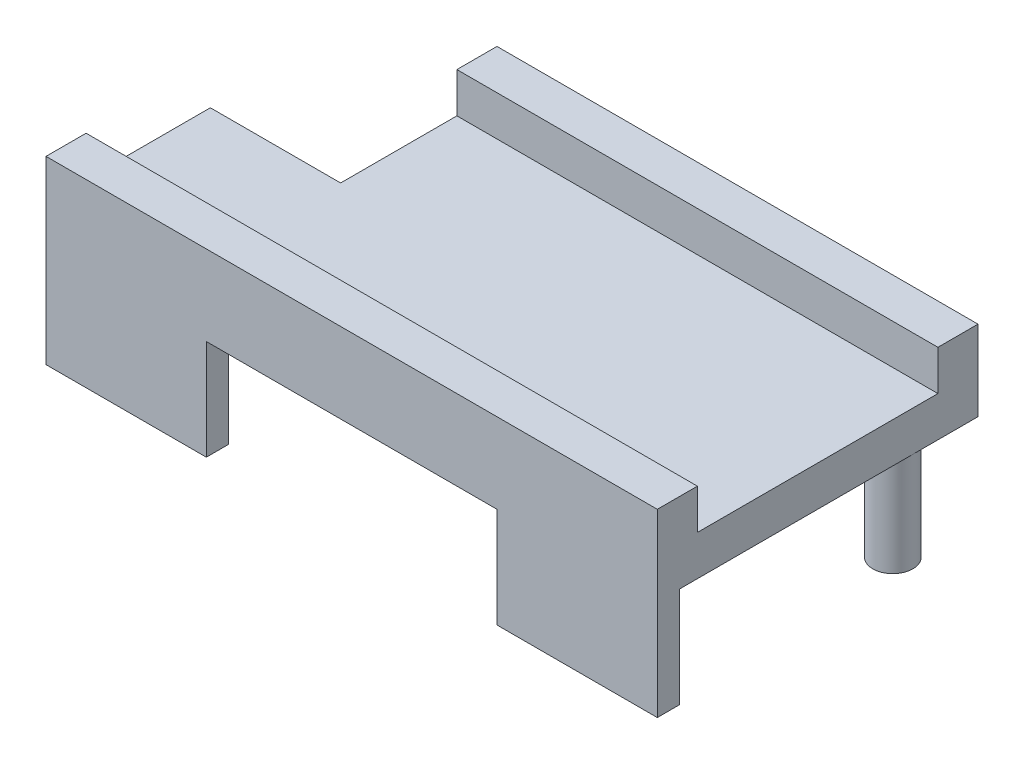
ISO-10303-21;
HEADER;
FILE_DESCRIPTION(('STEP AP214'),'2;1');
FILE_NAME('part.step','',(''),(''),'','','');
FILE_SCHEMA(('AUTOMOTIVE_DESIGN { 1 0 10303 214 1 1 1 1 }'));
ENDSEC;
DATA;
#1=APPLICATION_CONTEXT('core data for automotive mechanical design processes');
#2=APPLICATION_PROTOCOL_DEFINITION('international standard','automotive_design',2000,#1);
#3=PRODUCT_CONTEXT('',#1,'mechanical');
#4=PRODUCT('Part','Part','',(#3));
#5=PRODUCT_RELATED_PRODUCT_CATEGORY('part','',(#4));
#6=PRODUCT_DEFINITION_FORMATION('','',#4);
#7=PRODUCT_DEFINITION_CONTEXT('part definition',#1,'design');
#8=PRODUCT_DEFINITION('design','',#6,#7);
#9=PRODUCT_DEFINITION_SHAPE('','',#8);
#10=(LENGTH_UNIT() NAMED_UNIT(*) SI_UNIT(.MILLI.,.METRE.));
#11=(NAMED_UNIT(*) PLANE_ANGLE_UNIT() SI_UNIT($,.RADIAN.));
#12=(NAMED_UNIT(*) SI_UNIT($,.STERADIAN.) SOLID_ANGLE_UNIT());
#13=UNCERTAINTY_MEASURE_WITH_UNIT(LENGTH_MEASURE(1.E-05),#10,'distance_accuracy_value','');
#14=(GEOMETRIC_REPRESENTATION_CONTEXT(3) GLOBAL_UNCERTAINTY_ASSIGNED_CONTEXT((#13)) GLOBAL_UNIT_ASSIGNED_CONTEXT((#10,
#11,#12)) REPRESENTATION_CONTEXT('',''));
#15=CARTESIAN_POINT('',(0.,0.,0.));
#16=DIRECTION('',(0.,0.,1.));
#17=DIRECTION('',(1.,0.,0.));
#18=AXIS2_PLACEMENT_3D('',#15,#16,#17);
#19=CARTESIAN_POINT('',(-15.25,2.,-8.));
#20=DIRECTION('',(1.,0.,0.));
#21=DIRECTION('',(0.,0.,-1.));
#22=AXIS2_PLACEMENT_3D('',#19,#20,#21);
#23=PLANE('',#22);
#24=DIRECTION('',(0.,0.,-1.));
#25=VECTOR('',#24,1.);
#26=CARTESIAN_POINT('',(-15.25,-5.,8.));
#27=LINE('',#26,#25);
#28=CARTESIAN_POINT('',(-15.25,-5.,8.));
#29=VERTEX_POINT('',#28);
#30=CARTESIAN_POINT('',(-15.25,-5.,6.9));
#31=VERTEX_POINT('',#30);
#32=EDGE_CURVE('E207',#29,#31,#27,.T.);
#33=ORIENTED_EDGE('',*,*,#32,.F.);
#34=DIRECTION('',(0.,-1.,0.));
#35=VECTOR('',#34,1.);
#36=CARTESIAN_POINT('',(-15.25,2.,8.));
#37=LINE('',#36,#35);
#38=CARTESIAN_POINT('',(-15.25,4.,8.00000000000001));
#39=VERTEX_POINT('',#38);
#40=EDGE_CURVE('E331',#39,#29,#37,.T.);
#41=ORIENTED_EDGE('',*,*,#40,.F.);
#42=DIRECTION('',(0.,0.,1.));
#43=VECTOR('',#42,1.);
#44=CARTESIAN_POINT('',(-15.25,4.,8.00000000000001));
#45=LINE('',#44,#43);
#46=CARTESIAN_POINT('',(-15.25,4.,6.00000000000001));
#47=VERTEX_POINT('',#46);
#48=EDGE_CURVE('E190',#47,#39,#45,.T.);
#49=ORIENTED_EDGE('',*,*,#48,.F.);
#50=DIRECTION('',(0.,-1.,0.));
#51=VECTOR('',#50,1.);
#52=CARTESIAN_POINT('',(-15.25,4.,6.00000000000001));
#53=LINE('',#52,#51);
#54=CARTESIAN_POINT('',(-15.25,2.,6.00000000000001));
#55=VERTEX_POINT('',#54);
#56=EDGE_CURVE('E186',#47,#55,#53,.T.);
#57=ORIENTED_EDGE('',*,*,#56,.T.);
#58=DIRECTION('',(0.,0.,1.));
#59=VECTOR('',#58,1.);
#60=CARTESIAN_POINT('',(-15.25,2.,-8.));
#61=LINE('',#60,#59);
#62=CARTESIAN_POINT('',(-15.25,2.,-0.199999999999999));
#63=VERTEX_POINT('',#62);
#64=EDGE_CURVE('E316',#63,#55,#61,.T.);
#65=ORIENTED_EDGE('',*,*,#64,.F.);
#66=DIRECTION('',(0.,-1.,0.));
#67=VECTOR('',#66,1.);
#68=CARTESIAN_POINT('',(-15.25,10.,-0.199999999999999));
#69=LINE('',#68,#67);
#70=CARTESIAN_POINT('',(-15.25,0.,-0.199999999999999));
#71=VERTEX_POINT('',#70);
#72=EDGE_CURVE('E250',#63,#71,#69,.T.);
#73=ORIENTED_EDGE('',*,*,#72,.T.);
#74=DIRECTION('',(0.,0.,1.));
#75=VECTOR('',#74,1.);
#76=CARTESIAN_POINT('',(-15.25,0.,-8.));
#77=LINE('',#76,#75);
#78=CARTESIAN_POINT('',(-15.25,0.,6.9));
#79=VERTEX_POINT('',#78);
#80=EDGE_CURVE('E325',#71,#79,#77,.T.);
#81=ORIENTED_EDGE('',*,*,#80,.T.);
#82=DIRECTION('',(0.,1.,0.));
#83=VECTOR('',#82,1.);
#84=CARTESIAN_POINT('',(-15.25,-8.,6.9));
#85=LINE('',#84,#83);
#86=EDGE_CURVE('E270',#31,#79,#85,.T.);
#87=ORIENTED_EDGE('',*,*,#86,.F.);
#88=EDGE_LOOP('',(#33,#41,#49,#57,#65,#73,#81,#87));
#89=FACE_BOUND('',#88,.T.);
#90=ADVANCED_FACE('F44',(#89),#23,.F.);
#91=CARTESIAN_POINT('',(15.25,2.,-8.));
#92=DIRECTION('',(-1.,0.,0.));
#93=DIRECTION('',(0.,0.,1.));
#94=AXIS2_PLACEMENT_3D('',#91,#92,#93);
#95=PLANE('',#94);
#96=DIRECTION('',(0.,0.,1.));
#97=VECTOR('',#96,1.);
#98=CARTESIAN_POINT('',(15.25,-5.,8.));
#99=LINE('',#98,#97);
#100=CARTESIAN_POINT('',(15.25,-5.,6.9));
#101=VERTEX_POINT('',#100);
#102=CARTESIAN_POINT('',(15.25,-5.,8.));
#103=VERTEX_POINT('',#102);
#104=EDGE_CURVE('E232',#101,#103,#99,.T.);
#105=ORIENTED_EDGE('',*,*,#104,.F.);
#106=DIRECTION('',(0.,1.,0.));
#107=VECTOR('',#106,1.);
#108=CARTESIAN_POINT('',(15.25,-8.,6.9));
#109=LINE('',#108,#107);
#110=CARTESIAN_POINT('',(15.25,0.,6.9));
#111=VERTEX_POINT('',#110);
#112=EDGE_CURVE('E259',#101,#111,#109,.T.);
#113=ORIENTED_EDGE('',*,*,#112,.T.);
#114=DIRECTION('',(0.,0.,-1.));
#115=VECTOR('',#114,1.);
#116=CARTESIAN_POINT('',(15.25,0.,-8.));
#117=LINE('',#116,#115);
#118=CARTESIAN_POINT('',(15.25,0.,-8.));
#119=VERTEX_POINT('',#118);
#120=EDGE_CURVE('E309',#111,#119,#117,.T.);
#121=ORIENTED_EDGE('',*,*,#120,.T.);
#122=DIRECTION('',(0.,-1.,0.));
#123=VECTOR('',#122,1.);
#124=CARTESIAN_POINT('',(15.25,2.,-8.));
#125=LINE('',#124,#123);
#126=CARTESIAN_POINT('',(15.25,4.,-8.));
#127=VERTEX_POINT('',#126);
#128=EDGE_CURVE('E52',#127,#119,#125,.T.);
#129=ORIENTED_EDGE('',*,*,#128,.F.);
#130=DIRECTION('',(0.,0.,-1.));
#131=VECTOR('',#130,1.);
#132=CARTESIAN_POINT('',(15.25,4.,-6.));
#133=LINE('',#132,#131);
#134=CARTESIAN_POINT('',(15.25,4.,-6.));
#135=VERTEX_POINT('',#134);
#136=EDGE_CURVE('E219',#135,#127,#133,.T.);
#137=ORIENTED_EDGE('',*,*,#136,.F.);
#138=DIRECTION('',(0.,-1.,0.));
#139=VECTOR('',#138,1.);
#140=CARTESIAN_POINT('',(15.25,4.,-6.));
#141=LINE('',#140,#139);
#142=CARTESIAN_POINT('',(15.25,2.,-6.));
#143=VERTEX_POINT('',#142);
#144=EDGE_CURVE('E215',#135,#143,#141,.T.);
#145=ORIENTED_EDGE('',*,*,#144,.T.);
#146=DIRECTION('',(0.,0.,-1.));
#147=VECTOR('',#146,1.);
#148=CARTESIAN_POINT('',(15.25,2.,-8.));
#149=LINE('',#148,#147);
#150=CARTESIAN_POINT('',(15.25,2.,6.00000000000001));
#151=VERTEX_POINT('',#150);
#152=EDGE_CURVE('E203',#151,#143,#149,.T.);
#153=ORIENTED_EDGE('',*,*,#152,.F.);
#154=DIRECTION('',(0.,-1.,0.));
#155=VECTOR('',#154,1.);
#156=CARTESIAN_POINT('',(15.25,4.,6.00000000000001));
#157=LINE('',#156,#155);
#158=CARTESIAN_POINT('',(15.25,4.,6.00000000000001));
#159=VERTEX_POINT('',#158);
#160=EDGE_CURVE('E184',#159,#151,#157,.T.);
#161=ORIENTED_EDGE('',*,*,#160,.F.);
#162=DIRECTION('',(0.,0.,-1.));
#163=VECTOR('',#162,1.);
#164=CARTESIAN_POINT('',(15.25,4.,8.));
#165=LINE('',#164,#163);
#166=CARTESIAN_POINT('',(15.25,4.,8.));
#167=VERTEX_POINT('',#166);
#168=EDGE_CURVE('E191',#167,#159,#165,.T.);
#169=ORIENTED_EDGE('',*,*,#168,.F.);
#170=DIRECTION('',(0.,-1.,0.));
#171=VECTOR('',#170,1.);
#172=CARTESIAN_POINT('',(15.25,2.,8.));
#173=LINE('',#172,#171);
#174=EDGE_CURVE('E319',#167,#103,#173,.T.);
#175=ORIENTED_EDGE('',*,*,#174,.T.);
#176=EDGE_LOOP('',(#105,#113,#121,#129,#137,#145,#153,#161,#169,#175));
#177=FACE_BOUND('',#176,.T.);
#178=ADVANCED_FACE('F46',(#177),#95,.F.);
#179=CARTESIAN_POINT('',(-15.25,2.,8.));
#180=DIRECTION('',(0.,0.,-1.));
#181=DIRECTION('',(-1.,0.,0.));
#182=AXIS2_PLACEMENT_3D('',#179,#180,#181);
#183=PLANE('',#182);
#184=DIRECTION('',(-1.,0.,0.));
#185=VECTOR('',#184,1.);
#186=CARTESIAN_POINT('',(-15.25,-5.,8.));
#187=LINE('',#186,#185);
#188=CARTESIAN_POINT('',(7.24999999999999,-5.,8.));
#189=VERTEX_POINT('',#188);
#190=EDGE_CURVE('E235',#103,#189,#187,.T.);
#191=ORIENTED_EDGE('',*,*,#190,.F.);
#192=ORIENTED_EDGE('',*,*,#174,.F.);
#193=DIRECTION('',(1.,0.,0.));
#194=VECTOR('',#193,1.);
#195=CARTESIAN_POINT('',(15.25,4.,8.));
#196=LINE('',#195,#194);
#197=EDGE_CURVE('E197',#39,#167,#196,.T.);
#198=ORIENTED_EDGE('',*,*,#197,.F.);
#199=ORIENTED_EDGE('',*,*,#40,.T.);
#200=CARTESIAN_POINT('',(-7.25,-5.,8.));
#201=VERTEX_POINT('',#200);
#202=EDGE_CURVE('E234',#201,#29,#187,.T.);
#203=ORIENTED_EDGE('',*,*,#202,.F.);
#204=DIRECTION('',(0.,1.,0.));
#205=VECTOR('',#204,1.);
#206=CARTESIAN_POINT('',(-7.25,-8.,8.));
#207=LINE('',#206,#205);
#208=CARTESIAN_POINT('',(-7.25,0.,8.));
#209=VERTEX_POINT('',#208);
#210=EDGE_CURVE('E276',#201,#209,#207,.T.);
#211=ORIENTED_EDGE('',*,*,#210,.T.);
#212=DIRECTION('',(1.,0.,0.));
#213=VECTOR('',#212,1.);
#214=CARTESIAN_POINT('',(-15.25,0.,8.));
#215=LINE('',#214,#213);
#216=CARTESIAN_POINT('',(7.24999999999999,0.,8.));
#217=VERTEX_POINT('',#216);
#218=EDGE_CURVE('E317',#209,#217,#215,.T.);
#219=ORIENTED_EDGE('',*,*,#218,.T.);
#220=DIRECTION('',(0.,1.,0.));
#221=VECTOR('',#220,1.);
#222=CARTESIAN_POINT('',(7.25,-8.,8.));
#223=LINE('',#222,#221);
#224=EDGE_CURVE('E258',#189,#217,#223,.T.);
#225=ORIENTED_EDGE('',*,*,#224,.F.);
#226=EDGE_LOOP('',(#191,#192,#198,#199,#203,#211,#219,#225));
#227=FACE_BOUND('',#226,.T.);
#228=ADVANCED_FACE('F390',(#227),#183,.F.);
#229=CARTESIAN_POINT('',(14.2,-8.,-4.8));
#230=DIRECTION('',(0.,1.,0.));
#231=DIRECTION('',(0.,0.,1.));
#232=AXIS2_PLACEMENT_3D('',#229,#230,#231);
#233=CYLINDRICAL_SURFACE('',#232,1.);
#234=CARTESIAN_POINT('',(14.2,0.,-4.8));
#235=DIRECTION('',(0.,1.,0.));
#236=DIRECTION('',(0.,0.,1.));
#237=AXIS2_PLACEMENT_3D('',#234,#235,#236);
#238=CIRCLE('',#237,1.);
#239=CARTESIAN_POINT('',(14.2,0.,-3.8));
#240=VERTEX_POINT('',#239);
#241=EDGE_CURVE('E271',#240,#240,#238,.T.);
#242=ORIENTED_EDGE('',*,*,#241,.F.);
#243=EDGE_LOOP('',(#242));
#244=FACE_BOUND('',#243,.T.);
#245=CARTESIAN_POINT('',(14.2,-5.,-4.8));
#246=DIRECTION('',(0.,-1.,0.));
#247=DIRECTION('',(0.,0.,-1.));
#248=AXIS2_PLACEMENT_3D('',#245,#246,#247);
#249=CIRCLE('',#248,1.);
#250=CARTESIAN_POINT('',(14.2,-5.,-5.8));
#251=VERTEX_POINT('',#250);
#252=EDGE_CURVE('E204',#251,#251,#249,.T.);
#253=ORIENTED_EDGE('',*,*,#252,.F.);
#254=EDGE_LOOP('',(#253));
#255=FACE_BOUND('',#254,.T.);
#256=ADVANCED_FACE('F415',(#244,#255),#233,.T.);
#257=CARTESIAN_POINT('',(7.25,-8.,8.));
#258=DIRECTION('',(-1.,0.,0.));
#259=DIRECTION('',(0.,0.,1.));
#260=AXIS2_PLACEMENT_3D('',#257,#258,#259);
#261=PLANE('',#260);
#262=DIRECTION('',(0.,1.,0.));
#263=VECTOR('',#262,1.);
#264=CARTESIAN_POINT('',(7.25,-8.,6.9));
#265=LINE('',#264,#263);
#266=CARTESIAN_POINT('',(7.25,-5.,6.9));
#267=VERTEX_POINT('',#266);
#268=CARTESIAN_POINT('',(7.25,0.,6.9));
#269=VERTEX_POINT('',#268);
#270=EDGE_CURVE('E262',#267,#269,#265,.T.);
#271=ORIENTED_EDGE('',*,*,#270,.F.);
#272=DIRECTION('',(0.,0.,1.));
#273=VECTOR('',#272,1.);
#274=CARTESIAN_POINT('',(7.25,-5.,8.));
#275=LINE('',#274,#273);
#276=EDGE_CURVE('E236',#267,#189,#275,.T.);
#277=ORIENTED_EDGE('',*,*,#276,.T.);
#278=ORIENTED_EDGE('',*,*,#224,.T.);
#279=DIRECTION('',(0.,0.,1.));
#280=VECTOR('',#279,1.);
#281=CARTESIAN_POINT('',(7.25,0.,8.));
#282=LINE('',#281,#280);
#283=EDGE_CURVE('E261',#269,#217,#282,.T.);
#284=ORIENTED_EDGE('',*,*,#283,.F.);
#285=EDGE_LOOP('',(#271,#277,#278,#284));
#286=FACE_BOUND('',#285,.T.);
#287=ADVANCED_FACE('F437',(#286),#261,.T.);
#288=CARTESIAN_POINT('',(15.25,-8.,6.9));
#289=DIRECTION('',(0.,0.,-1.));
#290=DIRECTION('',(-1.,0.,0.));
#291=AXIS2_PLACEMENT_3D('',#288,#289,#290);
#292=PLANE('',#291);
#293=ORIENTED_EDGE('',*,*,#112,.F.);
#294=DIRECTION('',(1.,0.,0.));
#295=VECTOR('',#294,1.);
#296=CARTESIAN_POINT('',(-15.25,-5.,6.9));
#297=LINE('',#296,#295);
#298=EDGE_CURVE('E229',#267,#101,#297,.T.);
#299=ORIENTED_EDGE('',*,*,#298,.F.);
#300=ORIENTED_EDGE('',*,*,#270,.T.);
#301=DIRECTION('',(-1.,0.,0.));
#302=VECTOR('',#301,1.);
#303=CARTESIAN_POINT('',(15.25,0.,6.9));
#304=LINE('',#303,#302);
#305=EDGE_CURVE('E267',#111,#269,#304,.T.);
#306=ORIENTED_EDGE('',*,*,#305,.F.);
#307=EDGE_LOOP('',(#293,#299,#300,#306));
#308=FACE_BOUND('',#307,.T.);
#309=ADVANCED_FACE('F410',(#308),#292,.T.);
#310=CARTESIAN_POINT('',(-15.25,-8.,6.9));
#311=DIRECTION('',(0.,0.,-1.));
#312=DIRECTION('',(-1.,0.,0.));
#313=AXIS2_PLACEMENT_3D('',#310,#311,#312);
#314=PLANE('',#313);
#315=DIRECTION('',(0.,1.,0.));
#316=VECTOR('',#315,1.);
#317=CARTESIAN_POINT('',(-7.25,-8.,6.9));
#318=LINE('',#317,#316);
#319=CARTESIAN_POINT('',(-7.25,-5.,6.9));
#320=VERTEX_POINT('',#319);
#321=CARTESIAN_POINT('',(-7.25,0.,6.9));
#322=VERTEX_POINT('',#321);
#323=EDGE_CURVE('E279',#320,#322,#318,.T.);
#324=ORIENTED_EDGE('',*,*,#323,.F.);
#325=EDGE_CURVE('E230',#31,#320,#297,.T.);
#326=ORIENTED_EDGE('',*,*,#325,.F.);
#327=ORIENTED_EDGE('',*,*,#86,.T.);
#328=DIRECTION('',(-1.,0.,0.));
#329=VECTOR('',#328,1.);
#330=CARTESIAN_POINT('',(-15.25,0.,6.9));
#331=LINE('',#330,#329);
#332=EDGE_CURVE('E278',#322,#79,#331,.T.);
#333=ORIENTED_EDGE('',*,*,#332,.F.);
#334=EDGE_LOOP('',(#324,#326,#327,#333));
#335=FACE_BOUND('',#334,.T.);
#336=ADVANCED_FACE('F403',(#335),#314,.T.);
#337=CARTESIAN_POINT('',(-7.25,-8.,8.));
#338=DIRECTION('',(1.,0.,0.));
#339=DIRECTION('',(0.,0.,-1.));
#340=AXIS2_PLACEMENT_3D('',#337,#338,#339);
#341=PLANE('',#340);
#342=ORIENTED_EDGE('',*,*,#210,.F.);
#343=DIRECTION('',(0.,0.,-1.));
#344=VECTOR('',#343,1.);
#345=CARTESIAN_POINT('',(-7.25,-5.,8.));
#346=LINE('',#345,#344);
#347=EDGE_CURVE('E11',#201,#320,#346,.T.);
#348=ORIENTED_EDGE('',*,*,#347,.T.);
#349=ORIENTED_EDGE('',*,*,#323,.T.);
#350=DIRECTION('',(0.,0.,-1.));
#351=VECTOR('',#350,1.);
#352=CARTESIAN_POINT('',(-7.25,0.,8.));
#353=LINE('',#352,#351);
#354=EDGE_CURVE('E275',#209,#322,#353,.T.);
#355=ORIENTED_EDGE('',*,*,#354,.F.);
#356=EDGE_LOOP('',(#342,#348,#349,#355));
#357=FACE_BOUND('',#356,.T.);
#358=ADVANCED_FACE('F396',(#357),#341,.T.);
#359=CARTESIAN_POINT('',(-15.25,2.,-8.));
#360=DIRECTION('',(0.,0.,1.));
#361=DIRECTION('',(1.,0.,0.));
#362=AXIS2_PLACEMENT_3D('',#359,#360,#361);
#363=PLANE('',#362);
#364=DIRECTION('',(0.,-1.,0.));
#365=VECTOR('',#364,1.);
#366=CARTESIAN_POINT('',(-8.75,10.,-8.));
#367=LINE('',#366,#365);
#368=CARTESIAN_POINT('',(-8.75,4.,-8.));
#369=VERTEX_POINT('',#368);
#370=CARTESIAN_POINT('',(-8.75,0.,-8.));
#371=VERTEX_POINT('',#370);
#372=EDGE_CURVE('E246',#369,#371,#367,.T.);
#373=ORIENTED_EDGE('',*,*,#372,.F.);
#374=DIRECTION('',(-1.,0.,0.));
#375=VECTOR('',#374,1.);
#376=CARTESIAN_POINT('',(15.25,4.,-8.));
#377=LINE('',#376,#375);
#378=EDGE_CURVE('E223',#127,#369,#377,.T.);
#379=ORIENTED_EDGE('',*,*,#378,.F.);
#380=ORIENTED_EDGE('',*,*,#128,.T.);
#381=DIRECTION('',(-1.,0.,0.));
#382=VECTOR('',#381,1.);
#383=CARTESIAN_POINT('',(-15.25,0.,-8.));
#384=LINE('',#383,#382);
#385=CARTESIAN_POINT('',(-2.8,0.,-8.));
#386=VERTEX_POINT('',#385);
#387=EDGE_CURVE('E322',#119,#386,#384,.T.);
#388=ORIENTED_EDGE('',*,*,#387,.T.);
#389=DIRECTION('',(0.,1.,0.));
#390=VECTOR('',#389,1.);
#391=CARTESIAN_POINT('',(-2.8,-8.,-8.));
#392=LINE('',#391,#390);
#393=CARTESIAN_POINT('',(-2.8,-8.,-8.));
#394=VERTEX_POINT('',#393);
#395=EDGE_CURVE('E310',#394,#386,#392,.T.);
#396=ORIENTED_EDGE('',*,*,#395,.F.);
#397=DIRECTION('',(-1.,0.,0.));
#398=VECTOR('',#397,1.);
#399=CARTESIAN_POINT('',(-5.7,-8.,-8.));
#400=LINE('',#399,#398);
#401=CARTESIAN_POINT('',(-5.7,-8.,-8.));
#402=VERTEX_POINT('',#401);
#403=EDGE_CURVE('E296',#394,#402,#400,.T.);
#404=ORIENTED_EDGE('',*,*,#403,.T.);
#405=DIRECTION('',(0.,1.,0.));
#406=VECTOR('',#405,1.);
#407=CARTESIAN_POINT('',(-5.7,-8.,-8.));
#408=LINE('',#407,#406);
#409=CARTESIAN_POINT('',(-5.7,0.,-8.));
#410=VERTEX_POINT('',#409);
#411=EDGE_CURVE('E307',#402,#410,#408,.T.);
#412=ORIENTED_EDGE('',*,*,#411,.T.);
#413=EDGE_CURVE('E321',#410,#371,#384,.T.);
#414=ORIENTED_EDGE('',*,*,#413,.T.);
#415=EDGE_LOOP('',(#373,#379,#380,#388,#396,#404,#412,#414));
#416=FACE_BOUND('',#415,.T.);
#417=ADVANCED_FACE('F336',(#416),#363,.F.);
#418=CARTESIAN_POINT('',(0.,2.,0.));
#419=DIRECTION('',(0.,1.,0.));
#420=DIRECTION('',(0.,0.,1.));
#421=AXIS2_PLACEMENT_3D('',#418,#419,#420);
#422=PLANE('',#421);
#423=DIRECTION('',(-1.,0.,0.));
#424=VECTOR('',#423,1.);
#425=CARTESIAN_POINT('',(-15.25,2.,6.00000000000001));
#426=LINE('',#425,#424);
#427=EDGE_CURVE('E59',#151,#55,#426,.T.);
#428=ORIENTED_EDGE('',*,*,#427,.F.);
#429=ORIENTED_EDGE('',*,*,#152,.T.);
#430=DIRECTION('',(1.,0.,0.));
#431=VECTOR('',#430,1.);
#432=CARTESIAN_POINT('',(-8.75,2.,-6.));
#433=LINE('',#432,#431);
#434=CARTESIAN_POINT('',(-8.75,2.,-6.));
#435=VERTEX_POINT('',#434);
#436=EDGE_CURVE('E65',#435,#143,#433,.T.);
#437=ORIENTED_EDGE('',*,*,#436,.F.);
#438=DIRECTION('',(0.,0.,1.));
#439=VECTOR('',#438,1.);
#440=CARTESIAN_POINT('',(-8.75,2.,0.));
#441=LINE('',#440,#439);
#442=CARTESIAN_POINT('',(-8.75,2.,-0.199999999999999));
#443=VERTEX_POINT('',#442);
#444=EDGE_CURVE('E253',#435,#443,#441,.T.);
#445=ORIENTED_EDGE('',*,*,#444,.T.);
#446=DIRECTION('',(-1.,0.,0.));
#447=VECTOR('',#446,1.);
#448=CARTESIAN_POINT('',(0.,2.,-0.199999999999999));
#449=LINE('',#448,#447);
#450=EDGE_CURVE('E255',#443,#63,#449,.T.);
#451=ORIENTED_EDGE('',*,*,#450,.T.);
#452=ORIENTED_EDGE('',*,*,#64,.T.);
#453=EDGE_LOOP('',(#428,#429,#437,#445,#451,#452));
#454=FACE_BOUND('',#453,.T.);
#455=ADVANCED_FACE('F395',(#454),#422,.T.);
#456=CARTESIAN_POINT('',(0.,0.,0.));
#457=DIRECTION('',(0.,1.,0.));
#458=DIRECTION('',(0.,0.,1.));
#459=AXIS2_PLACEMENT_3D('',#456,#457,#458);
#460=PLANE('',#459);
#461=ORIENTED_EDGE('',*,*,#241,.T.);
#462=EDGE_LOOP('',(#461));
#463=FACE_BOUND('',#462,.T.);
#464=DIRECTION('',(1.,0.,0.));
#465=VECTOR('',#464,1.);
#466=CARTESIAN_POINT('',(-15.25,0.,-0.199999999999999));
#467=LINE('',#466,#465);
#468=CARTESIAN_POINT('',(-8.75,0.,-0.199999999999999));
#469=VERTEX_POINT('',#468);
#470=EDGE_CURVE('E240',#71,#469,#467,.T.);
#471=ORIENTED_EDGE('',*,*,#470,.T.);
#472=DIRECTION('',(0.,0.,-1.));
#473=VECTOR('',#472,1.);
#474=CARTESIAN_POINT('',(-8.75,0.,-8.));
#475=LINE('',#474,#473);
#476=EDGE_CURVE('E243',#469,#371,#475,.T.);
#477=ORIENTED_EDGE('',*,*,#476,.T.);
#478=ORIENTED_EDGE('',*,*,#413,.F.);
#479=DIRECTION('',(0.,0.,1.));
#480=VECTOR('',#479,1.);
#481=CARTESIAN_POINT('',(-5.7,0.,-8.));
#482=LINE('',#481,#480);
#483=CARTESIAN_POINT('',(-5.7,0.,-5.2));
#484=VERTEX_POINT('',#483);
#485=EDGE_CURVE('E274',#410,#484,#482,.T.);
#486=ORIENTED_EDGE('',*,*,#485,.T.);
#487=DIRECTION('',(1.,0.,0.));
#488=VECTOR('',#487,1.);
#489=CARTESIAN_POINT('',(-5.7,0.,-5.2));
#490=LINE('',#489,#488);
#491=CARTESIAN_POINT('',(-2.8,0.,-5.2));
#492=VERTEX_POINT('',#491);
#493=EDGE_CURVE('E302',#484,#492,#490,.T.);
#494=ORIENTED_EDGE('',*,*,#493,.T.);
#495=DIRECTION('',(0.,0.,-1.));
#496=VECTOR('',#495,1.);
#497=CARTESIAN_POINT('',(-2.8,0.,-8.));
#498=LINE('',#497,#496);
#499=EDGE_CURVE('E290',#492,#386,#498,.T.);
#500=ORIENTED_EDGE('',*,*,#499,.T.);
#501=ORIENTED_EDGE('',*,*,#387,.F.);
#502=ORIENTED_EDGE('',*,*,#120,.F.);
#503=ORIENTED_EDGE('',*,*,#305,.T.);
#504=ORIENTED_EDGE('',*,*,#283,.T.);
#505=ORIENTED_EDGE('',*,*,#218,.F.);
#506=ORIENTED_EDGE('',*,*,#354,.T.);
#507=ORIENTED_EDGE('',*,*,#332,.T.);
#508=ORIENTED_EDGE('',*,*,#80,.F.);
#509=EDGE_LOOP('',(#471,#477,#478,#486,#494,#500,#501,#502,#503,#504,#505,#506,#507,#508));
#510=FACE_BOUND('',#509,.T.);
#511=ADVANCED_FACE('F343',(#463,#510),#460,.F.);
#512=CARTESIAN_POINT('',(-5.7,-8.,-8.));
#513=DIRECTION('',(-1.,0.,0.));
#514=DIRECTION('',(0.,0.,1.));
#515=AXIS2_PLACEMENT_3D('',#512,#513,#514);
#516=PLANE('',#515);
#517=ORIENTED_EDGE('',*,*,#485,.F.);
#518=ORIENTED_EDGE('',*,*,#411,.F.);
#519=DIRECTION('',(0.,0.,1.));
#520=VECTOR('',#519,1.);
#521=CARTESIAN_POINT('',(-5.7,-8.,-8.));
#522=LINE('',#521,#520);
#523=CARTESIAN_POINT('',(-5.7,-8.,-5.2));
#524=VERTEX_POINT('',#523);
#525=EDGE_CURVE('E286',#402,#524,#522,.T.);
#526=ORIENTED_EDGE('',*,*,#525,.T.);
#527=DIRECTION('',(0.,1.,0.));
#528=VECTOR('',#527,1.);
#529=CARTESIAN_POINT('',(-5.7,-8.,-5.2));
#530=LINE('',#529,#528);
#531=EDGE_CURVE('E299',#524,#484,#530,.T.);
#532=ORIENTED_EDGE('',*,*,#531,.T.);
#533=EDGE_LOOP('',(#517,#518,#526,#532));
#534=FACE_BOUND('',#533,.T.);
#535=ADVANCED_FACE('F357',(#534),#516,.T.);
#536=CARTESIAN_POINT('',(-2.8,-8.,-8.));
#537=DIRECTION('',(1.,0.,0.));
#538=DIRECTION('',(0.,0.,-1.));
#539=AXIS2_PLACEMENT_3D('',#536,#537,#538);
#540=PLANE('',#539);
#541=ORIENTED_EDGE('',*,*,#499,.F.);
#542=DIRECTION('',(0.,1.,0.));
#543=VECTOR('',#542,1.);
#544=CARTESIAN_POINT('',(-2.8,-8.,-5.2));
#545=LINE('',#544,#543);
#546=CARTESIAN_POINT('',(-2.8,-8.,-5.2));
#547=VERTEX_POINT('',#546);
#548=EDGE_CURVE('E312',#547,#492,#545,.T.);
#549=ORIENTED_EDGE('',*,*,#548,.F.);
#550=DIRECTION('',(0.,0.,-1.));
#551=VECTOR('',#550,1.);
#552=CARTESIAN_POINT('',(-2.8,-8.,-8.));
#553=LINE('',#552,#551);
#554=EDGE_CURVE('E293',#547,#394,#553,.T.);
#555=ORIENTED_EDGE('',*,*,#554,.T.);
#556=ORIENTED_EDGE('',*,*,#395,.T.);
#557=EDGE_LOOP('',(#541,#549,#555,#556));
#558=FACE_BOUND('',#557,.T.);
#559=ADVANCED_FACE('F347',(#558),#540,.T.);
#560=CARTESIAN_POINT('',(-5.7,-8.,-5.2));
#561=DIRECTION('',(0.,0.,1.));
#562=DIRECTION('',(1.,0.,0.));
#563=AXIS2_PLACEMENT_3D('',#560,#561,#562);
#564=PLANE('',#563);
#565=ORIENTED_EDGE('',*,*,#493,.F.);
#566=ORIENTED_EDGE('',*,*,#531,.F.);
#567=DIRECTION('',(1.,0.,0.));
#568=VECTOR('',#567,1.);
#569=CARTESIAN_POINT('',(-5.7,-8.,-5.2));
#570=LINE('',#569,#568);
#571=EDGE_CURVE('E289',#524,#547,#570,.T.);
#572=ORIENTED_EDGE('',*,*,#571,.T.);
#573=ORIENTED_EDGE('',*,*,#548,.T.);
#574=EDGE_LOOP('',(#565,#566,#572,#573));
#575=FACE_BOUND('',#574,.T.);
#576=ADVANCED_FACE('F421',(#575),#564,.T.);
#577=CARTESIAN_POINT('',(0.,-8.,0.));
#578=DIRECTION('',(0.,1.,0.));
#579=DIRECTION('',(0.,0.,1.));
#580=AXIS2_PLACEMENT_3D('',#577,#578,#579);
#581=PLANE('',#580);
#582=ORIENTED_EDGE('',*,*,#525,.F.);
#583=ORIENTED_EDGE('',*,*,#403,.F.);
#584=ORIENTED_EDGE('',*,*,#554,.F.);
#585=ORIENTED_EDGE('',*,*,#571,.F.);
#586=EDGE_LOOP('',(#582,#583,#584,#585));
#587=FACE_BOUND('',#586,.T.);
#588=ADVANCED_FACE('F354',(#587),#581,.F.);
#589=CARTESIAN_POINT('',(-15.25,10.,-0.199999999999999));
#590=DIRECTION('',(0.,0.,-1.));
#591=DIRECTION('',(-1.,0.,0.));
#592=AXIS2_PLACEMENT_3D('',#589,#590,#591);
#593=PLANE('',#592);
#594=DIRECTION('',(0.,-1.,0.));
#595=VECTOR('',#594,1.);
#596=CARTESIAN_POINT('',(-8.75,10.,-0.199999999999999));
#597=LINE('',#596,#595);
#598=EDGE_CURVE('E248',#443,#469,#597,.T.);
#599=ORIENTED_EDGE('',*,*,#598,.T.);
#600=ORIENTED_EDGE('',*,*,#470,.F.);
#601=ORIENTED_EDGE('',*,*,#72,.F.);
#602=ORIENTED_EDGE('',*,*,#450,.F.);
#603=EDGE_LOOP('',(#599,#600,#601,#602));
#604=FACE_BOUND('',#603,.T.);
#605=ADVANCED_FACE('F420',(#604),#593,.T.);
#606=CARTESIAN_POINT('',(-8.75,10.,-8.));
#607=DIRECTION('',(-1.,0.,0.));
#608=DIRECTION('',(0.,0.,1.));
#609=AXIS2_PLACEMENT_3D('',#606,#607,#608);
#610=PLANE('',#609);
#611=ORIENTED_EDGE('',*,*,#372,.T.);
#612=ORIENTED_EDGE('',*,*,#476,.F.);
#613=ORIENTED_EDGE('',*,*,#598,.F.);
#614=ORIENTED_EDGE('',*,*,#444,.F.);
#615=DIRECTION('',(0.,-1.,0.));
#616=VECTOR('',#615,1.);
#617=CARTESIAN_POINT('',(-8.75,4.,-6.));
#618=LINE('',#617,#616);
#619=CARTESIAN_POINT('',(-8.75,4.,-6.));
#620=VERTEX_POINT('',#619);
#621=EDGE_CURVE('E212',#620,#435,#618,.T.);
#622=ORIENTED_EDGE('',*,*,#621,.F.);
#623=DIRECTION('',(0.,0.,1.));
#624=VECTOR('',#623,1.);
#625=CARTESIAN_POINT('',(-8.75,4.,-8.));
#626=LINE('',#625,#624);
#627=EDGE_CURVE('E221',#369,#620,#626,.T.);
#628=ORIENTED_EDGE('',*,*,#627,.F.);
#629=EDGE_LOOP('',(#611,#612,#613,#614,#622,#628));
#630=FACE_BOUND('',#629,.T.);
#631=ADVANCED_FACE('F365',(#630),#610,.T.);
#632=CARTESIAN_POINT('',(0.,-5.,0.));
#633=DIRECTION('',(0.,-1.,0.));
#634=DIRECTION('',(0.,0.,-1.));
#635=AXIS2_PLACEMENT_3D('',#632,#633,#634);
#636=PLANE('',#635);
#637=ORIENTED_EDGE('',*,*,#202,.T.);
#638=ORIENTED_EDGE('',*,*,#32,.T.);
#639=ORIENTED_EDGE('',*,*,#325,.T.);
#640=ORIENTED_EDGE('',*,*,#347,.F.);
#641=EDGE_LOOP('',(#637,#638,#639,#640));
#642=FACE_BOUND('',#641,.T.);
#643=ADVANCED_FACE('F467',(#642),#636,.T.);
#644=ORIENTED_EDGE('',*,*,#298,.T.);
#645=ORIENTED_EDGE('',*,*,#104,.T.);
#646=ORIENTED_EDGE('',*,*,#190,.T.);
#647=ORIENTED_EDGE('',*,*,#276,.F.);
#648=EDGE_LOOP('',(#644,#645,#646,#647));
#649=FACE_BOUND('',#648,.T.);
#650=ADVANCED_FACE('F380',(#649),#636,.T.);
#651=CARTESIAN_POINT('',(14.2,-5.,-4.8));
#652=DIRECTION('',(0.,-1.,0.));
#653=DIRECTION('',(0.,0.,-1.));
#654=AXIS2_PLACEMENT_3D('',#651,#652,#653);
#655=PLANE('',#654);
#656=ORIENTED_EDGE('',*,*,#252,.T.);
#657=EDGE_LOOP('',(#656));
#658=FACE_BOUND('',#657,.T.);
#659=ADVANCED_FACE('F372',(#658),#655,.T.);
#660=CARTESIAN_POINT('',(-8.75,4.,-6.));
#661=DIRECTION('',(0.,0.,-1.));
#662=DIRECTION('',(-1.,0.,0.));
#663=AXIS2_PLACEMENT_3D('',#660,#661,#662);
#664=PLANE('',#663);
#665=ORIENTED_EDGE('',*,*,#436,.T.);
#666=ORIENTED_EDGE('',*,*,#144,.F.);
#667=DIRECTION('',(1.,0.,0.));
#668=VECTOR('',#667,1.);
#669=CARTESIAN_POINT('',(-8.75,4.,-6.));
#670=LINE('',#669,#668);
#671=EDGE_CURVE('E217',#620,#135,#670,.T.);
#672=ORIENTED_EDGE('',*,*,#671,.F.);
#673=ORIENTED_EDGE('',*,*,#621,.T.);
#674=EDGE_LOOP('',(#665,#666,#672,#673));
#675=FACE_BOUND('',#674,.T.);
#676=ADVANCED_FACE('F370',(#675),#664,.F.);
#677=CARTESIAN_POINT('',(0.,4.,0.));
#678=DIRECTION('',(0.,1.,0.));
#679=DIRECTION('',(0.,0.,1.));
#680=AXIS2_PLACEMENT_3D('',#677,#678,#679);
#681=PLANE('',#680);
#682=ORIENTED_EDGE('',*,*,#136,.T.);
#683=ORIENTED_EDGE('',*,*,#378,.T.);
#684=ORIENTED_EDGE('',*,*,#627,.T.);
#685=ORIENTED_EDGE('',*,*,#671,.T.);
#686=EDGE_LOOP('',(#682,#683,#684,#685));
#687=FACE_BOUND('',#686,.T.);
#688=ADVANCED_FACE('F363',(#687),#681,.T.);
#689=CARTESIAN_POINT('',(-15.25,4.,6.00000000000001));
#690=DIRECTION('',(0.,0.,1.));
#691=DIRECTION('',(1.,0.,0.));
#692=AXIS2_PLACEMENT_3D('',#689,#690,#691);
#693=PLANE('',#692);
#694=ORIENTED_EDGE('',*,*,#427,.T.);
#695=ORIENTED_EDGE('',*,*,#56,.F.);
#696=DIRECTION('',(-1.,0.,0.));
#697=VECTOR('',#696,1.);
#698=CARTESIAN_POINT('',(-15.25,4.,6.00000000000001));
#699=LINE('',#698,#697);
#700=EDGE_CURVE('E180',#159,#47,#699,.T.);
#701=ORIENTED_EDGE('',*,*,#700,.F.);
#702=ORIENTED_EDGE('',*,*,#160,.T.);
#703=EDGE_LOOP('',(#694,#695,#701,#702));
#704=FACE_BOUND('',#703,.T.);
#705=ADVANCED_FACE('F182',(#704),#693,.F.);
#706=CARTESIAN_POINT('',(0.,4.,0.));
#707=DIRECTION('',(0.,-1.,0.));
#708=DIRECTION('',(0.,0.,-1.));
#709=AXIS2_PLACEMENT_3D('',#706,#707,#708);
#710=PLANE('',#709);
#711=ORIENTED_EDGE('',*,*,#168,.T.);
#712=ORIENTED_EDGE('',*,*,#700,.T.);
#713=ORIENTED_EDGE('',*,*,#48,.T.);
#714=ORIENTED_EDGE('',*,*,#197,.T.);
#715=EDGE_LOOP('',(#711,#712,#713,#714));
#716=FACE_BOUND('',#715,.T.);
#717=ADVANCED_FACE('F195',(#716),#710,.F.);
#718=CLOSED_SHELL('',(#90,#178,#228,#256,#287,#309,#336,#358,#417,#455,#511,#535,#559,#576,#588,
#605,#631,#643,#650,#659,#676,#688,#705,#717));
#719=MANIFOLD_SOLID_BREP('B2',#718);
#720=ADVANCED_BREP_SHAPE_REPRESENTATION('',(#18,#719),#14);
#721=SHAPE_DEFINITION_REPRESENTATION(#9,#720);
ENDSEC;
END-ISO-10303-21;
